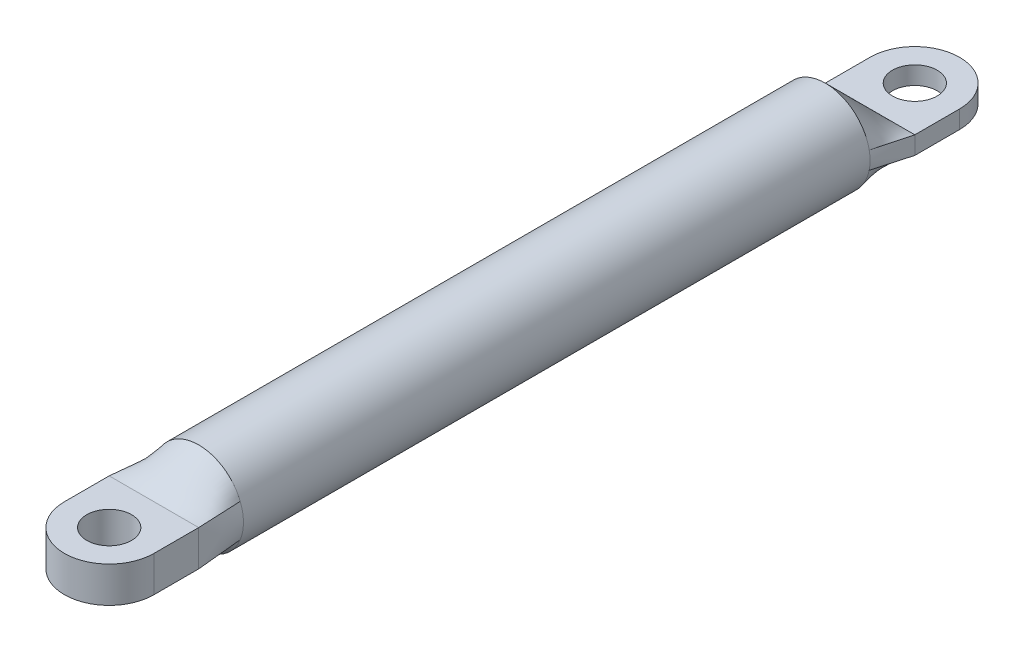
ISO-10303-21;
HEADER;
FILE_DESCRIPTION(('STEP AP214'),'2;1');
FILE_NAME('part.step','',(''),(''),'','','');
FILE_SCHEMA(('AUTOMOTIVE_DESIGN { 1 0 10303 214 1 1 1 1 }'));
ENDSEC;
DATA;
#1=APPLICATION_CONTEXT('core data for automotive mechanical design processes');
#2=APPLICATION_PROTOCOL_DEFINITION('international standard','automotive_design',2000,#1);
#3=PRODUCT_CONTEXT('',#1,'mechanical');
#4=PRODUCT('Part','Part','',(#3));
#5=PRODUCT_RELATED_PRODUCT_CATEGORY('part','',(#4));
#6=PRODUCT_DEFINITION_FORMATION('','',#4);
#7=PRODUCT_DEFINITION_CONTEXT('part definition',#1,'design');
#8=PRODUCT_DEFINITION('design','',#6,#7);
#9=PRODUCT_DEFINITION_SHAPE('','',#8);
#10=(LENGTH_UNIT() NAMED_UNIT(*) SI_UNIT(.MILLI.,.METRE.));
#11=(NAMED_UNIT(*) PLANE_ANGLE_UNIT() SI_UNIT($,.RADIAN.));
#12=(NAMED_UNIT(*) SI_UNIT($,.STERADIAN.) SOLID_ANGLE_UNIT());
#13=UNCERTAINTY_MEASURE_WITH_UNIT(LENGTH_MEASURE(1.E-05),#10,'distance_accuracy_value','');
#14=(GEOMETRIC_REPRESENTATION_CONTEXT(3) GLOBAL_UNCERTAINTY_ASSIGNED_CONTEXT((#13)) GLOBAL_UNIT_ASSIGNED_CONTEXT((#10,
#11,#12)) REPRESENTATION_CONTEXT('',''));
#15=CARTESIAN_POINT('',(0.,0.,0.));
#16=DIRECTION('',(0.,0.,1.));
#17=DIRECTION('',(1.,0.,0.));
#18=AXIS2_PLACEMENT_3D('',#15,#16,#17);
#19=CARTESIAN_POINT('',(-5.,2.,75.));
#20=DIRECTION('',(0.,1.,0.));
#21=DIRECTION('',(-1.,0.,0.));
#22=AXIS2_PLACEMENT_3D('',#19,#20,#21);
#23=PLANE('',#22);
#24=CARTESIAN_POINT('',(0.,2.,80.));
#25=DIRECTION('',(0.,1.,0.));
#26=DIRECTION('',(-1.,0.,0.));
#27=AXIS2_PLACEMENT_3D('',#24,#25,#26);
#28=CIRCLE('',#27,2.5);
#29=CARTESIAN_POINT('',(-2.5,2.,80.));
#30=VERTEX_POINT('',#29);
#31=EDGE_CURVE('E274',#30,#30,#28,.T.);
#32=ORIENTED_EDGE('',*,*,#31,.F.);
#33=EDGE_LOOP('',(#32));
#34=FACE_BOUND('',#33,.T.);
#35=CARTESIAN_POINT('',(0.,2.,80.));
#36=DIRECTION('',(0.,1.,0.));
#37=DIRECTION('',(-1.,0.,0.));
#38=AXIS2_PLACEMENT_3D('',#35,#36,#37);
#39=CIRCLE('',#38,5.);
#40=CARTESIAN_POINT('',(-5.,2.,80.));
#41=VERTEX_POINT('',#40);
#42=CARTESIAN_POINT('',(5.,2.,80.));
#43=VERTEX_POINT('',#42);
#44=EDGE_CURVE('E495',#41,#43,#39,.T.);
#45=ORIENTED_EDGE('',*,*,#44,.T.);
#46=DIRECTION('',(0.,0.,1.));
#47=VECTOR('',#46,1.);
#48=CARTESIAN_POINT('',(5.,2.,75.));
#49=LINE('',#48,#47);
#50=CARTESIAN_POINT('',(5.,2.,75.));
#51=VERTEX_POINT('',#50);
#52=EDGE_CURVE('E283',#51,#43,#49,.T.);
#53=ORIENTED_EDGE('',*,*,#52,.F.);
#54=DIRECTION('',(-1.,0.,0.));
#55=VECTOR('',#54,1.);
#56=CARTESIAN_POINT('',(-5.,2.,75.));
#57=LINE('',#56,#55);
#58=CARTESIAN_POINT('',(-5.,2.,75.));
#59=VERTEX_POINT('',#58);
#60=EDGE_CURVE('E345',#51,#59,#57,.T.);
#61=ORIENTED_EDGE('',*,*,#60,.T.);
#62=DIRECTION('',(0.,0.,1.));
#63=VECTOR('',#62,1.);
#64=CARTESIAN_POINT('',(-5.,2.,75.));
#65=LINE('',#64,#63);
#66=EDGE_CURVE('E290',#59,#41,#65,.T.);
#67=ORIENTED_EDGE('',*,*,#66,.T.);
#68=EDGE_LOOP('',(#45,#53,#61,#67));
#69=FACE_BOUND('',#68,.T.);
#70=ADVANCED_FACE('F174',(#34,#69),#23,.T.);
#71=CARTESIAN_POINT('',(-5.,-2.,75.));
#72=DIRECTION('',(0.,-1.,0.));
#73=DIRECTION('',(1.,0.,0.));
#74=AXIS2_PLACEMENT_3D('',#71,#72,#73);
#75=PLANE('',#74);
#76=CARTESIAN_POINT('',(0.,-2.,80.));
#77=DIRECTION('',(0.,-1.,0.));
#78=DIRECTION('',(1.,0.,0.));
#79=AXIS2_PLACEMENT_3D('',#76,#77,#78);
#80=CIRCLE('',#79,2.5);
#81=CARTESIAN_POINT('',(2.5,-2.,80.));
#82=VERTEX_POINT('',#81);
#83=EDGE_CURVE('E490',#82,#82,#80,.T.);
#84=ORIENTED_EDGE('',*,*,#83,.F.);
#85=EDGE_LOOP('',(#84));
#86=FACE_BOUND('',#85,.T.);
#87=DIRECTION('',(0.,0.,1.));
#88=VECTOR('',#87,1.);
#89=CARTESIAN_POINT('',(5.,-2.,75.));
#90=LINE('',#89,#88);
#91=CARTESIAN_POINT('',(5.,-2.,75.));
#92=VERTEX_POINT('',#91);
#93=CARTESIAN_POINT('',(5.,-2.,80.));
#94=VERTEX_POINT('',#93);
#95=EDGE_CURVE('E280',#92,#94,#90,.T.);
#96=ORIENTED_EDGE('',*,*,#95,.T.);
#97=CARTESIAN_POINT('',(0.,-2.,80.));
#98=DIRECTION('',(0.,-1.,0.));
#99=DIRECTION('',(1.,0.,0.));
#100=AXIS2_PLACEMENT_3D('',#97,#98,#99);
#101=CIRCLE('',#100,5.);
#102=CARTESIAN_POINT('',(-5.,-2.,80.));
#103=VERTEX_POINT('',#102);
#104=EDGE_CURVE('E265',#94,#103,#101,.T.);
#105=ORIENTED_EDGE('',*,*,#104,.T.);
#106=DIRECTION('',(0.,0.,1.));
#107=VECTOR('',#106,1.);
#108=CARTESIAN_POINT('',(-5.,-2.,75.));
#109=LINE('',#108,#107);
#110=CARTESIAN_POINT('',(-5.,-2.,75.));
#111=VERTEX_POINT('',#110);
#112=EDGE_CURVE('E288',#111,#103,#109,.T.);
#113=ORIENTED_EDGE('',*,*,#112,.F.);
#114=DIRECTION('',(1.,0.,0.));
#115=VECTOR('',#114,1.);
#116=CARTESIAN_POINT('',(-5.,-2.,75.));
#117=LINE('',#116,#115);
#118=EDGE_CURVE('E286',#111,#92,#117,.T.);
#119=ORIENTED_EDGE('',*,*,#118,.T.);
#120=EDGE_LOOP('',(#96,#105,#113,#119));
#121=FACE_BOUND('',#120,.T.);
#122=ADVANCED_FACE('F284',(#86,#121),#75,.T.);
#123=CARTESIAN_POINT('',(5.,2.,75.));
#124=DIRECTION('',(1.,0.,0.));
#125=DIRECTION('',(0.,0.,-1.));
#126=AXIS2_PLACEMENT_3D('',#123,#124,#125);
#127=PLANE('',#126);
#128=ORIENTED_EDGE('',*,*,#52,.T.);
#129=DIRECTION('',(0.,-1.,0.));
#130=VECTOR('',#129,1.);
#131=CARTESIAN_POINT('',(5.,8.,80.));
#132=LINE('',#131,#130);
#133=EDGE_CURVE('E12',#43,#94,#132,.T.);
#134=ORIENTED_EDGE('',*,*,#133,.T.);
#135=ORIENTED_EDGE('',*,*,#95,.F.);
#136=DIRECTION('',(0.,1.,0.));
#137=VECTOR('',#136,1.);
#138=CARTESIAN_POINT('',(5.,2.,75.));
#139=LINE('',#138,#137);
#140=EDGE_CURVE('E296',#92,#51,#139,.T.);
#141=ORIENTED_EDGE('',*,*,#140,.T.);
#142=EDGE_LOOP('',(#128,#134,#135,#141));
#143=FACE_BOUND('',#142,.T.);
#144=ADVANCED_FACE('F278',(#143),#127,.T.);
#145=CARTESIAN_POINT('',(-5.,-2.,-5.));
#146=DIRECTION('',(0.,-1.,0.));
#147=DIRECTION('',(1.,0.,0.));
#148=AXIS2_PLACEMENT_3D('',#145,#146,#147);
#149=PLANE('',#148);
#150=CARTESIAN_POINT('',(0.,-2.,-10.));
#151=DIRECTION('',(0.,-1.,0.));
#152=DIRECTION('',(1.,0.,0.));
#153=AXIS2_PLACEMENT_3D('',#150,#151,#152);
#154=CIRCLE('',#153,2.5);
#155=CARTESIAN_POINT('',(2.5,-2.,-10.));
#156=VERTEX_POINT('',#155);
#157=EDGE_CURVE('E505',#156,#156,#154,.T.);
#158=ORIENTED_EDGE('',*,*,#157,.F.);
#159=EDGE_LOOP('',(#158));
#160=FACE_BOUND('',#159,.T.);
#161=CARTESIAN_POINT('',(0.,-2.,-10.));
#162=DIRECTION('',(0.,-1.,0.));
#163=DIRECTION('',(1.,0.,0.));
#164=AXIS2_PLACEMENT_3D('',#161,#162,#163);
#165=CIRCLE('',#164,5.);
#166=CARTESIAN_POINT('',(-5.,-2.,-10.));
#167=VERTEX_POINT('',#166);
#168=CARTESIAN_POINT('',(5.,-2.,-10.));
#169=VERTEX_POINT('',#168);
#170=EDGE_CURVE('E497',#167,#169,#165,.T.);
#171=ORIENTED_EDGE('',*,*,#170,.T.);
#172=DIRECTION('',(0.,0.,-1.));
#173=VECTOR('',#172,1.);
#174=CARTESIAN_POINT('',(5.,-2.,-5.));
#175=LINE('',#174,#173);
#176=CARTESIAN_POINT('',(5.,-2.,-5.));
#177=VERTEX_POINT('',#176);
#178=EDGE_CURVE('E618',#177,#169,#175,.T.);
#179=ORIENTED_EDGE('',*,*,#178,.F.);
#180=DIRECTION('',(-1.,0.,0.));
#181=VECTOR('',#180,1.);
#182=CARTESIAN_POINT('',(-5.,-2.,-5.));
#183=LINE('',#182,#181);
#184=CARTESIAN_POINT('',(-5.,-2.,-5.));
#185=VERTEX_POINT('',#184);
#186=EDGE_CURVE('E582',#177,#185,#183,.T.);
#187=ORIENTED_EDGE('',*,*,#186,.T.);
#188=DIRECTION('',(0.,0.,-1.));
#189=VECTOR('',#188,1.);
#190=CARTESIAN_POINT('',(-5.,-2.,-5.));
#191=LINE('',#190,#189);
#192=EDGE_CURVE('E516',#185,#167,#191,.T.);
#193=ORIENTED_EDGE('',*,*,#192,.T.);
#194=EDGE_LOOP('',(#171,#179,#187,#193));
#195=FACE_BOUND('',#194,.T.);
#196=ADVANCED_FACE('F658',(#160,#195),#149,.T.);
#197=CARTESIAN_POINT('',(-5.,0.,-5.));
#198=DIRECTION('',(0.,1.,0.));
#199=DIRECTION('',(0.,0.,1.));
#200=AXIS2_PLACEMENT_3D('',#197,#198,#199);
#201=PLANE('',#200);
#202=CARTESIAN_POINT('',(0.,0.,-10.));
#203=DIRECTION('',(0.,1.,0.));
#204=DIRECTION('',(0.,0.,1.));
#205=AXIS2_PLACEMENT_3D('',#202,#203,#204);
#206=CIRCLE('',#205,2.5);
#207=CARTESIAN_POINT('',(0.,0.,-7.5));
#208=VERTEX_POINT('',#207);
#209=EDGE_CURVE('E292',#208,#208,#206,.T.);
#210=ORIENTED_EDGE('',*,*,#209,.F.);
#211=EDGE_LOOP('',(#210));
#212=FACE_BOUND('',#211,.T.);
#213=DIRECTION('',(0.,0.,-1.));
#214=VECTOR('',#213,1.);
#215=CARTESIAN_POINT('',(5.,0.,-5.));
#216=LINE('',#215,#214);
#217=CARTESIAN_POINT('',(5.,0.,-5.));
#218=VERTEX_POINT('',#217);
#219=CARTESIAN_POINT('',(5.,0.,-10.));
#220=VERTEX_POINT('',#219);
#221=EDGE_CURVE('E583',#218,#220,#216,.T.);
#222=ORIENTED_EDGE('',*,*,#221,.T.);
#223=CARTESIAN_POINT('',(0.,0.,-10.));
#224=DIRECTION('',(0.,1.,0.));
#225=DIRECTION('',(0.,0.,1.));
#226=AXIS2_PLACEMENT_3D('',#223,#224,#225);
#227=CIRCLE('',#226,5.);
#228=CARTESIAN_POINT('',(-5.,0.,-10.));
#229=VERTEX_POINT('',#228);
#230=EDGE_CURVE('E502',#220,#229,#227,.T.);
#231=ORIENTED_EDGE('',*,*,#230,.T.);
#232=DIRECTION('',(0.,0.,-1.));
#233=VECTOR('',#232,1.);
#234=CARTESIAN_POINT('',(-5.,0.,-5.));
#235=LINE('',#234,#233);
#236=CARTESIAN_POINT('',(-5.,0.,-5.));
#237=VERTEX_POINT('',#236);
#238=EDGE_CURVE('E625',#237,#229,#235,.T.);
#239=ORIENTED_EDGE('',*,*,#238,.F.);
#240=DIRECTION('',(1.,0.,0.));
#241=VECTOR('',#240,1.);
#242=CARTESIAN_POINT('',(-5.,0.,-5.));
#243=LINE('',#242,#241);
#244=EDGE_CURVE('E581',#237,#218,#243,.T.);
#245=ORIENTED_EDGE('',*,*,#244,.T.);
#246=EDGE_LOOP('',(#222,#231,#239,#245));
#247=FACE_BOUND('',#246,.T.);
#248=ADVANCED_FACE('F563',(#212,#247),#201,.T.);
#249=CARTESIAN_POINT('',(-5.,-2.,-5.));
#250=DIRECTION('',(-1.,0.,0.));
#251=DIRECTION('',(0.,-1.,0.));
#252=AXIS2_PLACEMENT_3D('',#249,#250,#251);
#253=PLANE('',#252);
#254=ORIENTED_EDGE('',*,*,#238,.T.);
#255=DIRECTION('',(0.,-1.,0.));
#256=VECTOR('',#255,1.);
#257=CARTESIAN_POINT('',(-5.,8.,-10.));
#258=LINE('',#257,#256);
#259=EDGE_CURVE('E499',#229,#167,#258,.T.);
#260=ORIENTED_EDGE('',*,*,#259,.T.);
#261=ORIENTED_EDGE('',*,*,#192,.F.);
#262=DIRECTION('',(0.,1.,0.));
#263=VECTOR('',#262,1.);
#264=CARTESIAN_POINT('',(-5.,-2.,-5.));
#265=LINE('',#264,#263);
#266=EDGE_CURVE('E644',#185,#237,#265,.T.);
#267=ORIENTED_EDGE('',*,*,#266,.T.);
#268=EDGE_LOOP('',(#254,#260,#261,#267));
#269=FACE_BOUND('',#268,.T.);
#270=ADVANCED_FACE('F649',(#269),#253,.T.);
#271=CARTESIAN_POINT('',(0.,0.,70.));
#272=DIRECTION('',(0.,0.,-1.));
#273=DIRECTION('',(-1.,0.,0.));
#274=AXIS2_PLACEMENT_3D('',#271,#272,#273);
#275=CYLINDRICAL_SURFACE('',#274,5.);
#276=CARTESIAN_POINT('',(4.6423834544263,1.85695338177052,70.));
#277=CARTESIAN_POINT('',(4.49870529350676,2.21614878406937,70.));
#278=CARTESIAN_POINT('',(4.30154981109881,2.58802255416943,70.));
#279=CARTESIAN_POINT('',(3.77223814216323,3.3123120198832,70.));
#280=CARTESIAN_POINT('',(3.43923374409662,3.66440961704776,70.));
#281=CARTESIAN_POINT('',(2.63502577278945,4.27935342835578,70.));
#282=CARTESIAN_POINT('',(2.16337330174003,4.54099630327165,70.));
#283=CARTESIAN_POINT('',(1.12751303544947,4.90199406608167,70.));
#284=CARTESIAN_POINT('',(0.564194134522417,5.,70.));
#285=CARTESIAN_POINT('',(-0.564194134522417,5.,70.));
#286=CARTESIAN_POINT('',(-1.12751303544947,4.90199406608167,70.));
#287=CARTESIAN_POINT('',(-2.16337330174003,4.54099630327165,70.));
#288=CARTESIAN_POINT('',(-2.63502577278945,4.27935342835578,70.));
#289=CARTESIAN_POINT('',(-3.43923374409662,3.66440961704776,70.));
#290=CARTESIAN_POINT('',(-3.77223814216323,3.3123120198832,70.));
#291=CARTESIAN_POINT('',(-4.30154981109881,2.58802255416943,70.));
#292=CARTESIAN_POINT('',(-4.49870529350676,2.21614878406937,70.));
#293=CARTESIAN_POINT('',(-4.6423834544263,1.85695338177052,70.));
#294=B_SPLINE_CURVE_WITH_KNOTS('',3,(#276,#277,#278,#279,#280,#281,#282,#283,#284,#285,#286,
#287,#288,#289,#290,#291,#292,#293),.UNSPECIFIED.,.F.,.F.,(4,2,2,2,2,2,2,2,4),(0.,0.125,0.25,
0.375,0.5,0.625,0.75,0.875,1.),.UNSPECIFIED.);
#295=CARTESIAN_POINT('',(4.64238538206064,1.85695415467658,70.));
#296=VERTEX_POINT('',#295);
#297=CARTESIAN_POINT('',(-4.6423935071418,1.85695742210553,70.));
#298=VERTEX_POINT('',#297);
#299=EDGE_CURVE('E431',#296,#298,#294,.T.);
#300=ORIENTED_EDGE('',*,*,#299,.F.);
#301=CARTESIAN_POINT('',(0.,0.,70.));
#302=DIRECTION('',(0.,0.,1.));
#303=DIRECTION('',(1.,0.,0.));
#304=AXIS2_PLACEMENT_3D('',#301,#302,#303);
#305=CIRCLE('',#304,5.);
#306=CARTESIAN_POINT('',(4.64239388700254,-1.85695757568858,70.));
#307=VERTEX_POINT('',#306);
#308=EDGE_CURVE('E442',#307,#296,#305,.T.);
#309=ORIENTED_EDGE('',*,*,#308,.F.);
#310=CARTESIAN_POINT('',(-4.64238576158105,-1.85695430712494,70.));
#311=VERTEX_POINT('',#310);
#312=EDGE_CURVE('E190',#311,#307,#305,.T.);
#313=ORIENTED_EDGE('',*,*,#312,.F.);
#314=EDGE_CURVE('E196',#298,#311,#305,.T.);
#315=ORIENTED_EDGE('',*,*,#314,.F.);
#316=EDGE_LOOP('',(#300,#309,#313,#315));
#317=FACE_BOUND('',#316,.T.);
#318=CARTESIAN_POINT('',(-4.9029033784546,0.980580675690921,0.));
#319=CARTESIAN_POINT('',(-4.82277517332639,1.38122170133195,0.));
#320=CARTESIAN_POINT('',(-4.68552918294742,1.81427330045434,0.));
#321=CARTESIAN_POINT('',(-4.23803019041123,2.69905009923053,0.));
#322=CARTESIAN_POINT('',(-3.92599697956843,3.15097619292763,0.));
#323=CARTESIAN_POINT('',(-3.09275421168397,3.97202399767275,0.));
#324=CARTESIAN_POINT('',(-2.56966190982729,4.33897322808948,0.));
#325=CARTESIAN_POINT('',(-1.6655051020658,4.7258391324945,0.));
#326=CARTESIAN_POINT('',(-1.34511491537968,4.82751837329654,0.));
#327=CARTESIAN_POINT('',(-0.68309613954826,4.9646397094076,0.));
#328=CARTESIAN_POINT('',(-0.341584959466065,5.,0.));
#329=CARTESIAN_POINT('',(0.341584959466066,5.,0.));
#330=CARTESIAN_POINT('',(0.68309613954826,4.9646397094076,0.));
#331=CARTESIAN_POINT('',(1.34511491537968,4.82751837329654,0.));
#332=CARTESIAN_POINT('',(1.6655051020658,4.7258391324945,0.));
#333=CARTESIAN_POINT('',(2.56966190982729,4.33897322808948,0.));
#334=CARTESIAN_POINT('',(3.09275421168397,3.97202399767275,0.));
#335=CARTESIAN_POINT('',(3.92599697956842,3.15097619292763,0.));
#336=CARTESIAN_POINT('',(4.23803019041124,2.69905009923053,0.));
#337=CARTESIAN_POINT('',(4.68552918294742,1.81427330045434,0.));
#338=CARTESIAN_POINT('',(4.82277517332639,1.38122170133195,0.));
#339=CARTESIAN_POINT('',(4.9029033784546,0.980580675690918,0.));
#340=B_SPLINE_CURVE_WITH_KNOTS('',3,(#318,#319,#320,#321,#322,#323,#324,#325,#326,#327,#328,
#329,#330,#331,#332,#333,#334,#335,#336,#337,#338,#339),.UNSPECIFIED.,.F.,.F.,(4,2,2,2,2,2,2,2,
2,2,4),(0.,0.125,0.25,0.375,0.4375,0.5,0.5625,0.625,0.75,0.875,1.),.UNSPECIFIED.);
#341=CARTESIAN_POINT('',(4.90342057429518,0.980684180448184,0.));
#342=VERTEX_POINT('',#341);
#343=CARTESIAN_POINT('',(-4.9033645088601,0.980672996415892,0.));
#344=VERTEX_POINT('',#343);
#345=EDGE_CURVE('E595',#342,#344,#340,.F.);
#346=ORIENTED_EDGE('',*,*,#345,.T.);
#347=CARTESIAN_POINT('',(0.,0.,0.));
#348=DIRECTION('',(0.,0.,1.));
#349=DIRECTION('',(1.,0.,0.));
#350=AXIS2_PLACEMENT_3D('',#347,#348,#349);
#351=CIRCLE('',#350,5.);
#352=CARTESIAN_POINT('',(-4.90336493756195,-0.980672932522098,0.));
#353=VERTEX_POINT('',#352);
#354=EDGE_CURVE('E614',#344,#353,#351,.T.);
#355=ORIENTED_EDGE('',*,*,#354,.T.);
#356=CARTESIAN_POINT('',(4.90330892844045,-0.98066176918323,0.));
#357=VERTEX_POINT('',#356);
#358=EDGE_CURVE('E610',#353,#357,#351,.T.);
#359=ORIENTED_EDGE('',*,*,#358,.T.);
#360=EDGE_CURVE('E612',#357,#342,#351,.T.);
#361=ORIENTED_EDGE('',*,*,#360,.T.);
#362=EDGE_LOOP('',(#346,#355,#359,#361));
#363=FACE_BOUND('',#362,.T.);
#364=ADVANCED_FACE('F176',(#317,#363),#275,.T.);
#365=CARTESIAN_POINT('',(4.9029033784546,-0.980580675690924,0.));
#366=CARTESIAN_POINT('',(5.,-2.,-5.));
#367=CARTESIAN_POINT('',(4.82277517332639,-1.38122170133195,0.));
#368=CARTESIAN_POINT('',(4.58333333333333,-2.,-5.));
#369=CARTESIAN_POINT('',(4.68552918294742,-1.81427330045434,0.));
#370=CARTESIAN_POINT('',(4.16666666666667,-2.,-5.));
#371=CARTESIAN_POINT('',(4.23803019041123,-2.69905009923053,0.));
#372=CARTESIAN_POINT('',(3.33333333333333,-2.,-5.));
#373=CARTESIAN_POINT('',(3.92599697956842,-3.15097619292764,0.));
#374=CARTESIAN_POINT('',(2.91666666666667,-2.,-5.));
#375=CARTESIAN_POINT('',(3.09275421168397,-3.97202399767275,0.));
#376=CARTESIAN_POINT('',(2.08333333333333,-2.,-5.));
#377=CARTESIAN_POINT('',(2.56966190982729,-4.33897322808948,0.));
#378=CARTESIAN_POINT('',(1.66666666666667,-2.,-5.));
#379=CARTESIAN_POINT('',(1.6655051020658,-4.7258391324945,0.));
#380=CARTESIAN_POINT('',(1.04166666666667,-2.,-5.));
#381=CARTESIAN_POINT('',(1.34511491537967,-4.82751837329654,0.));
#382=CARTESIAN_POINT('',(0.833333333333332,-2.,-5.));
#383=CARTESIAN_POINT('',(0.683096139548257,-4.9646397094076,0.));
#384=CARTESIAN_POINT('',(0.416666666666665,-2.,-5.));
#385=CARTESIAN_POINT('',(0.341584959466062,-5.,0.));
#386=CARTESIAN_POINT('',(0.208333333333331,-2.,-5.));
#387=CARTESIAN_POINT('',(-0.341584959466068,-5.,0.));
#388=CARTESIAN_POINT('',(-0.208333333333336,-2.,-5.));
#389=CARTESIAN_POINT('',(-0.683096139548263,-4.9646397094076,0.));
#390=CARTESIAN_POINT('',(-0.416666666666668,-2.,-5.));
#391=CARTESIAN_POINT('',(-1.34511491537968,-4.82751837329654,0.));
#392=CARTESIAN_POINT('',(-0.833333333333334,-2.,-5.));
#393=CARTESIAN_POINT('',(-1.66550510206581,-4.7258391324945,0.));
#394=CARTESIAN_POINT('',(-1.04166666666667,-2.,-5.));
#395=CARTESIAN_POINT('',(-2.56966190982729,-4.33897322808948,0.));
#396=CARTESIAN_POINT('',(-1.66666666666667,-2.,-5.));
#397=CARTESIAN_POINT('',(-3.09275421168397,-3.97202399767275,0.));
#398=CARTESIAN_POINT('',(-2.08333333333333,-2.,-5.));
#399=CARTESIAN_POINT('',(-3.92599697956843,-3.15097619292763,0.));
#400=CARTESIAN_POINT('',(-2.91666666666667,-2.,-5.));
#401=CARTESIAN_POINT('',(-4.23803019041124,-2.69905009923052,0.));
#402=CARTESIAN_POINT('',(-3.33333333333333,-2.,-5.));
#403=CARTESIAN_POINT('',(-4.68552918294742,-1.81427330045433,0.));
#404=CARTESIAN_POINT('',(-4.16666666666667,-2.,-5.));
#405=CARTESIAN_POINT('',(-4.8227751733264,-1.38122170133194,0.));
#406=CARTESIAN_POINT('',(-4.58333333333333,-2.,-5.));
#407=CARTESIAN_POINT('',(-4.9029033784546,-0.980580675690917,0.));
#408=CARTESIAN_POINT('',(-5.,-2.,-5.));
#409=B_SPLINE_SURFACE_WITH_KNOTS('',3,1,((#365,#366),(#367,#368),(#369,#370),(#371,#372),(#373,
#374),(#375,#376),(#377,#378),(#379,#380),(#381,#382),(#383,#384),(#385,#386),(#387,#388),(#389,
#390),(#391,#392),(#393,#394),(#395,#396),(#397,#398),(#399,#400),(#401,#402),(#403,#404),(#405,
#406),(#407,#408)),.UNSPECIFIED.,.F.,.F.,.F.,(4,2,2,2,2,2,2,2,2,2,4),(2,2),(0.,0.125,0.25,0.375,
0.4375,0.5,0.5625,0.625,0.75,0.875,1.),(0.,1.),.UNSPECIFIED.);
#410=DIRECTION('',(-0.0190244260279846,-0.199737820102712,-0.979664674485572));
#411=VECTOR('',#410,1.);
#412=CARTESIAN_POINT('',(-4.9514516892273,-1.49029033784546,-2.5));
#413=LINE('',#412,#411);
#414=EDGE_CURVE('E615',#353,#185,#413,.T.);
#415=DIRECTION('',(-0.0190244260279844,0.199737820102711,0.979664674485572));
#416=VECTOR('',#415,1.);
#417=CARTESIAN_POINT('',(4.9514516892273,-1.49029033784546,-2.5));
#418=LINE('',#417,#416);
#419=EDGE_CURVE('E754',#177,#357,#418,.T.);
#420=ORIENTED_EDGE('',*,*,#358,.F.);
#421=ORIENTED_EDGE('',*,*,#414,.T.);
#422=ORIENTED_EDGE('',*,*,#186,.F.);
#423=ORIENTED_EDGE('',*,*,#419,.T.);
#424=EDGE_LOOP('',(#420,#421,#422,#423));
#425=FACE_BOUND('',#424,.T.);
#426=ADVANCED_FACE('F663',(#425),#409,.T.);
#427=CARTESIAN_POINT('',(-4.9029033784546,-0.980580675690918,0.));
#428=CARTESIAN_POINT('',(-5.,-2.,-5.));
#429=CARTESIAN_POINT('',(-4.96700594255717,-0.660067855178098,0.));
#430=CARTESIAN_POINT('',(-5.,-1.66666666666667,-5.));
#431=CARTESIAN_POINT('',(-4.99905722460845,-0.330033927589048,0.));
#432=CARTESIAN_POINT('',(-5.,-1.33333333333333,-5.));
#433=CARTESIAN_POINT('',(-4.99905722460845,0.330033927589051,0.));
#434=CARTESIAN_POINT('',(-5.,-0.666666666666665,-5.));
#435=CARTESIAN_POINT('',(-4.96700594255716,0.660067855178101,0.));
#436=CARTESIAN_POINT('',(-5.,-0.333333333333332,-5.));
#437=CARTESIAN_POINT('',(-4.9029033784546,0.980580675690921,0.));
#438=CARTESIAN_POINT('',(-5.,0.,-5.));
#439=B_SPLINE_SURFACE_WITH_KNOTS('',3,1,((#427,#428),(#429,#430),(#431,#432),(#433,#434),(#435,
#436),(#437,#438)),.UNSPECIFIED.,.F.,.F.,.F.,(4,2,4),(2,2),(0.,0.5,1.),(0.,1.),.UNSPECIFIED.);
#440=DIRECTION('',(-0.0190528551333828,-0.192415155781688,-0.981128634041824));
#441=VECTOR('',#440,1.);
#442=CARTESIAN_POINT('',(-4.9514516892273,0.490290337845461,-2.5));
#443=LINE('',#442,#441);
#444=EDGE_CURVE('E747',#344,#237,#443,.T.);
#445=ORIENTED_EDGE('',*,*,#354,.F.);
#446=ORIENTED_EDGE('',*,*,#444,.T.);
#447=ORIENTED_EDGE('',*,*,#266,.F.);
#448=ORIENTED_EDGE('',*,*,#414,.F.);
#449=EDGE_LOOP('',(#445,#446,#447,#448));
#450=FACE_BOUND('',#449,.T.);
#451=ADVANCED_FACE('F687',(#450),#439,.T.);
#452=CARTESIAN_POINT('',(4.9029033784546,0.980580675690919,0.));
#453=CARTESIAN_POINT('',(5.,0.,-5.));
#454=CARTESIAN_POINT('',(4.96700594255716,0.660067855178098,0.));
#455=CARTESIAN_POINT('',(5.,-0.333333333333334,-5.));
#456=CARTESIAN_POINT('',(4.99905722460845,0.330033927589048,0.));
#457=CARTESIAN_POINT('',(5.,-0.666666666666667,-5.));
#458=CARTESIAN_POINT('',(4.99905722460845,-0.330033927589053,0.));
#459=CARTESIAN_POINT('',(5.,-1.33333333333333,-5.));
#460=CARTESIAN_POINT('',(4.96700594255716,-0.660067855178104,0.));
#461=CARTESIAN_POINT('',(5.,-1.66666666666667,-5.));
#462=CARTESIAN_POINT('',(4.9029033784546,-0.980580675690924,0.));
#463=CARTESIAN_POINT('',(5.,-2.,-5.));
#464=B_SPLINE_SURFACE_WITH_KNOTS('',3,1,((#452,#453),(#454,#455),(#456,#457),(#458,#459),(#460,
#461),(#462,#463)),.UNSPECIFIED.,.F.,.F.,.F.,(4,2,4),(2,2),(0.,0.5,1.),(0.,1.),.UNSPECIFIED.);
#465=DIRECTION('',(0.,-1.,0.));
#466=VECTOR('',#465,1.);
#467=CARTESIAN_POINT('',(5.,-2.,-5.));
#468=LINE('',#467,#466);
#469=EDGE_CURVE('E573',#218,#177,#468,.T.);
#470=DIRECTION('',(0.0190528551333828,-0.192415155781688,-0.981128634041824));
#471=VECTOR('',#470,1.);
#472=CARTESIAN_POINT('',(4.9514516892273,0.490290337845459,-2.5));
#473=LINE('',#472,#471);
#474=EDGE_CURVE('E755',#342,#218,#473,.T.);
#475=ORIENTED_EDGE('',*,*,#360,.F.);
#476=ORIENTED_EDGE('',*,*,#419,.F.);
#477=ORIENTED_EDGE('',*,*,#469,.F.);
#478=ORIENTED_EDGE('',*,*,#474,.F.);
#479=EDGE_LOOP('',(#475,#476,#477,#478));
#480=FACE_BOUND('',#479,.T.);
#481=ADVANCED_FACE('F558',(#480),#464,.T.);
#482=CARTESIAN_POINT('',(-4.9029033784546,0.980580675690921,0.));
#483=CARTESIAN_POINT('',(-5.,0.,-5.));
#484=CARTESIAN_POINT('',(-4.82277517332639,1.38122170133195,0.));
#485=CARTESIAN_POINT('',(-4.58333333333333,0.,-5.));
#486=CARTESIAN_POINT('',(-4.68552918294742,1.81427330045434,0.));
#487=CARTESIAN_POINT('',(-4.16666666666667,0.,-5.));
#488=CARTESIAN_POINT('',(-4.23803019041123,2.69905009923053,0.));
#489=CARTESIAN_POINT('',(-3.33333333333333,0.,-5.));
#490=CARTESIAN_POINT('',(-3.92599697956843,3.15097619292763,0.));
#491=CARTESIAN_POINT('',(-2.91666666666667,0.,-5.));
#492=CARTESIAN_POINT('',(-3.09275421168397,3.97202399767275,0.));
#493=CARTESIAN_POINT('',(-2.08333333333333,0.,-5.));
#494=CARTESIAN_POINT('',(-2.56966190982729,4.33897322808948,0.));
#495=CARTESIAN_POINT('',(-1.66666666666666,0.,-5.));
#496=CARTESIAN_POINT('',(-1.6655051020658,4.7258391324945,0.));
#497=CARTESIAN_POINT('',(-1.04166666666666,0.,-5.));
#498=CARTESIAN_POINT('',(-1.34511491537968,4.82751837329654,0.));
#499=CARTESIAN_POINT('',(-0.833333333333332,0.,-5.));
#500=CARTESIAN_POINT('',(-0.68309613954826,4.9646397094076,0.));
#501=CARTESIAN_POINT('',(-0.416666666666665,0.,-5.));
#502=CARTESIAN_POINT('',(-0.341584959466065,5.,0.));
#503=CARTESIAN_POINT('',(-0.208333333333332,0.,-5.));
#504=CARTESIAN_POINT('',(0.341584959466066,5.,0.));
#505=CARTESIAN_POINT('',(0.208333333333334,0.,-5.));
#506=CARTESIAN_POINT('',(0.68309613954826,4.9646397094076,0.));
#507=CARTESIAN_POINT('',(0.416666666666668,0.,-5.));
#508=CARTESIAN_POINT('',(1.34511491537968,4.82751837329654,0.));
#509=CARTESIAN_POINT('',(0.833333333333335,0.,-5.));
#510=CARTESIAN_POINT('',(1.6655051020658,4.7258391324945,0.));
#511=CARTESIAN_POINT('',(1.04166666666667,0.,-5.));
#512=CARTESIAN_POINT('',(2.56966190982729,4.33897322808948,0.));
#513=CARTESIAN_POINT('',(1.66666666666667,0.,-5.));
#514=CARTESIAN_POINT('',(3.09275421168397,3.97202399767275,0.));
#515=CARTESIAN_POINT('',(2.08333333333333,0.,-5.));
#516=CARTESIAN_POINT('',(3.92599697956842,3.15097619292763,0.));
#517=CARTESIAN_POINT('',(2.91666666666667,0.,-5.));
#518=CARTESIAN_POINT('',(4.23803019041124,2.69905009923053,0.));
#519=CARTESIAN_POINT('',(3.33333333333333,0.,-5.));
#520=CARTESIAN_POINT('',(4.68552918294742,1.81427330045434,0.));
#521=CARTESIAN_POINT('',(4.16666666666667,0.,-5.));
#522=CARTESIAN_POINT('',(4.82277517332639,1.38122170133195,0.));
#523=CARTESIAN_POINT('',(4.58333333333333,0.,-5.));
#524=CARTESIAN_POINT('',(4.9029033784546,0.980580675690918,0.));
#525=CARTESIAN_POINT('',(5.,0.,-5.));
#526=B_SPLINE_SURFACE_WITH_KNOTS('',3,1,((#482,#483),(#484,#485),(#486,#487),(#488,#489),(#490,
#491),(#492,#493),(#494,#495),(#496,#497),(#498,#499),(#500,#501),(#502,#503),(#504,#505),(#506,
#507),(#508,#509),(#510,#511),(#512,#513),(#514,#515),(#516,#517),(#518,#519),(#520,#521),(#522,
#523),(#524,#525)),.UNSPECIFIED.,.F.,.F.,.F.,(4,2,2,2,2,2,2,2,2,2,4),(2,2),(0.,0.125,0.25,0.375,
0.4375,0.5,0.5625,0.625,0.75,0.875,1.),(0.,1.),.UNSPECIFIED.);
#527=ORIENTED_EDGE('',*,*,#345,.F.);
#528=ORIENTED_EDGE('',*,*,#474,.T.);
#529=ORIENTED_EDGE('',*,*,#244,.F.);
#530=ORIENTED_EDGE('',*,*,#444,.F.);
#531=EDGE_LOOP('',(#527,#528,#529,#530));
#532=FACE_BOUND('',#531,.T.);
#533=ADVANCED_FACE('F553',(#532),#526,.T.);
#534=CARTESIAN_POINT('',(5.,-2.,-5.));
#535=DIRECTION('',(1.,0.,0.));
#536=DIRECTION('',(0.,1.,0.));
#537=AXIS2_PLACEMENT_3D('',#534,#535,#536);
#538=PLANE('',#537);
#539=DIRECTION('',(0.,-1.,0.));
#540=VECTOR('',#539,1.);
#541=CARTESIAN_POINT('',(5.,8.,-10.));
#542=LINE('',#541,#540);
#543=EDGE_CURVE('E183',#220,#169,#542,.T.);
#544=ORIENTED_EDGE('',*,*,#543,.F.);
#545=ORIENTED_EDGE('',*,*,#221,.F.);
#546=ORIENTED_EDGE('',*,*,#469,.T.);
#547=ORIENTED_EDGE('',*,*,#178,.T.);
#548=EDGE_LOOP('',(#544,#545,#546,#547));
#549=FACE_BOUND('',#548,.T.);
#550=ADVANCED_FACE('F548',(#549),#538,.T.);
#551=CARTESIAN_POINT('',(-4.6423834544263,1.85695338177052,70.));
#552=CARTESIAN_POINT('',(-5.,2.,75.));
#553=CARTESIAN_POINT('',(-4.87226851189756,1.28224073809236,70.));
#554=CARTESIAN_POINT('',(-5.,1.33333333333333,75.));
#555=CARTESIAN_POINT('',(-5.,0.641941345224174,70.));
#556=CARTESIAN_POINT('',(-5.,0.666666666666664,75.));
#557=CARTESIAN_POINT('',(-5.,-0.641941345224173,70.));
#558=CARTESIAN_POINT('',(-5.,-0.666666666666669,75.));
#559=CARTESIAN_POINT('',(-4.87226851189756,-1.28224073809236,70.));
#560=CARTESIAN_POINT('',(-5.,-1.33333333333334,75.));
#561=CARTESIAN_POINT('',(-4.6423834544263,-1.85695338177052,70.));
#562=CARTESIAN_POINT('',(-5.,-2.,75.));
#563=B_SPLINE_SURFACE_WITH_KNOTS('',3,1,((#551,#552),(#553,#554),(#555,#556),(#557,#558),(#559,
#560),(#561,#562)),.UNSPECIFIED.,.F.,.F.,.F.,(4,2,4),(2,2),(0.,0.5,1.),(0.,1.),.UNSPECIFIED.);
#564=DIRECTION('',(-0.0713120365150496,-0.0285248146060203,0.997046101441537));
#565=VECTOR('',#564,1.);
#566=CARTESIAN_POINT('',(-4.82119172721315,-1.92847669088526,72.5));
#567=LINE('',#566,#565);
#568=EDGE_CURVE('E459',#311,#111,#567,.T.);
#569=DIRECTION('',(0.,-1.,0.));
#570=VECTOR('',#569,1.);
#571=CARTESIAN_POINT('',(-5.,2.,75.));
#572=LINE('',#571,#570);
#573=EDGE_CURVE('E337',#59,#111,#572,.T.);
#574=DIRECTION('',(0.0713120365150499,-0.0285248146060197,-0.997046101441537));
#575=VECTOR('',#574,1.);
#576=CARTESIAN_POINT('',(-4.82119172721315,1.92847669088526,72.5));
#577=LINE('',#576,#575);
#578=EDGE_CURVE('E381',#59,#298,#577,.T.);
#579=ORIENTED_EDGE('',*,*,#314,.T.);
#580=ORIENTED_EDGE('',*,*,#568,.T.);
#581=ORIENTED_EDGE('',*,*,#573,.F.);
#582=ORIENTED_EDGE('',*,*,#578,.T.);
#583=EDGE_LOOP('',(#579,#580,#581,#582));
#584=FACE_BOUND('',#583,.T.);
#585=ADVANCED_FACE('F325',(#584),#563,.T.);
#586=CARTESIAN_POINT('',(-4.6423834544263,-1.85695338177052,70.));
#587=CARTESIAN_POINT('',(-5.,-2.,75.));
#588=CARTESIAN_POINT('',(-4.49870529350676,-2.21614878406937,70.));
#589=CARTESIAN_POINT('',(-4.58333333333333,-2.,75.));
#590=CARTESIAN_POINT('',(-4.30154981109881,-2.58802255416943,70.));
#591=CARTESIAN_POINT('',(-4.16666666666667,-2.,75.));
#592=CARTESIAN_POINT('',(-3.77223814216323,-3.3123120198832,70.));
#593=CARTESIAN_POINT('',(-3.33333333333333,-2.,75.));
#594=CARTESIAN_POINT('',(-3.43923374409662,-3.66440961704776,70.));
#595=CARTESIAN_POINT('',(-2.91666666666667,-2.,75.));
#596=CARTESIAN_POINT('',(-2.63502577278945,-4.27935342835578,70.));
#597=CARTESIAN_POINT('',(-2.08333333333333,-2.,75.));
#598=CARTESIAN_POINT('',(-2.16337330174003,-4.54099630327165,70.));
#599=CARTESIAN_POINT('',(-1.66666666666667,-2.,75.));
#600=CARTESIAN_POINT('',(-1.12751303544947,-4.90199406608167,70.));
#601=CARTESIAN_POINT('',(-0.833333333333335,-2.,75.));
#602=CARTESIAN_POINT('',(-0.564194134522418,-5.,70.));
#603=CARTESIAN_POINT('',(-0.416666666666668,-2.,75.));
#604=CARTESIAN_POINT('',(0.564194134522417,-5.,70.));
#605=CARTESIAN_POINT('',(0.416666666666665,-2.,75.));
#606=CARTESIAN_POINT('',(1.12751303544947,-4.90199406608167,70.));
#607=CARTESIAN_POINT('',(0.833333333333332,-2.,75.));
#608=CARTESIAN_POINT('',(2.16337330174003,-4.54099630327165,70.));
#609=CARTESIAN_POINT('',(1.66666666666666,-2.,75.));
#610=CARTESIAN_POINT('',(2.63502577278945,-4.27935342835578,70.));
#611=CARTESIAN_POINT('',(2.08333333333333,-2.,75.));
#612=CARTESIAN_POINT('',(3.43923374409662,-3.66440961704776,70.));
#613=CARTESIAN_POINT('',(2.91666666666666,-2.,75.));
#614=CARTESIAN_POINT('',(3.77223814216323,-3.3123120198832,70.));
#615=CARTESIAN_POINT('',(3.33333333333333,-2.,75.));
#616=CARTESIAN_POINT('',(4.30154981109881,-2.58802255416943,70.));
#617=CARTESIAN_POINT('',(4.16666666666667,-2.,75.));
#618=CARTESIAN_POINT('',(4.49870529350676,-2.21614878406937,70.));
#619=CARTESIAN_POINT('',(4.58333333333333,-2.,75.));
#620=CARTESIAN_POINT('',(4.6423834544263,-1.85695338177052,70.));
#621=CARTESIAN_POINT('',(5.,-2.,75.));
#622=B_SPLINE_SURFACE_WITH_KNOTS('',3,1,((#586,#587),(#588,#589),(#590,#591),(#592,#593),(#594,
#595),(#596,#597),(#598,#599),(#600,#601),(#602,#603),(#604,#605),(#606,#607),(#608,#609),(#610,
#611),(#612,#613),(#614,#615),(#616,#617),(#618,#619),(#620,#621)),.UNSPECIFIED.,.F.,.F.,.F.,(4,
2,2,2,2,2,2,2,4),(2,2),(0.,0.125,0.25,0.375,0.5,0.625,0.75,0.875,1.),(0.,1.),.UNSPECIFIED.);
#623=DIRECTION('',(0.0713120365150501,-0.02852481460602,0.997046101441537));
#624=VECTOR('',#623,1.);
#625=CARTESIAN_POINT('',(4.82119172721315,-1.92847669088526,72.5));
#626=LINE('',#625,#624);
#627=EDGE_CURVE('E377',#307,#92,#626,.T.);
#628=ORIENTED_EDGE('',*,*,#312,.T.);
#629=ORIENTED_EDGE('',*,*,#627,.T.);
#630=ORIENTED_EDGE('',*,*,#118,.F.);
#631=ORIENTED_EDGE('',*,*,#568,.F.);
#632=EDGE_LOOP('',(#628,#629,#630,#631));
#633=FACE_BOUND('',#632,.T.);
#634=ADVANCED_FACE('F408',(#633),#622,.T.);
#635=CARTESIAN_POINT('',(4.6423834544263,1.85695338177052,70.));
#636=CARTESIAN_POINT('',(5.,2.,75.));
#637=CARTESIAN_POINT('',(4.49870529350676,2.21614878406937,70.));
#638=CARTESIAN_POINT('',(4.58333333333333,2.,75.));
#639=CARTESIAN_POINT('',(4.30154981109881,2.58802255416943,70.));
#640=CARTESIAN_POINT('',(4.16666666666667,2.,75.));
#641=CARTESIAN_POINT('',(3.77223814216323,3.3123120198832,70.));
#642=CARTESIAN_POINT('',(3.33333333333333,2.,75.));
#643=CARTESIAN_POINT('',(3.43923374409662,3.66440961704776,70.));
#644=CARTESIAN_POINT('',(2.91666666666667,2.,75.));
#645=CARTESIAN_POINT('',(2.63502577278945,4.27935342835578,70.));
#646=CARTESIAN_POINT('',(2.08333333333334,2.,75.));
#647=CARTESIAN_POINT('',(2.16337330174003,4.54099630327165,70.));
#648=CARTESIAN_POINT('',(1.66666666666667,2.,75.));
#649=CARTESIAN_POINT('',(1.12751303544947,4.90199406608167,70.));
#650=CARTESIAN_POINT('',(0.833333333333336,2.,75.));
#651=CARTESIAN_POINT('',(0.564194134522417,5.,70.));
#652=CARTESIAN_POINT('',(0.41666666666667,2.,75.));
#653=CARTESIAN_POINT('',(-0.564194134522417,5.,70.));
#654=CARTESIAN_POINT('',(-0.416666666666664,2.,75.));
#655=CARTESIAN_POINT('',(-1.12751303544947,4.90199406608167,70.));
#656=CARTESIAN_POINT('',(-0.83333333333333,2.,75.));
#657=CARTESIAN_POINT('',(-2.16337330174003,4.54099630327165,70.));
#658=CARTESIAN_POINT('',(-1.66666666666666,2.,75.));
#659=CARTESIAN_POINT('',(-2.63502577278945,4.27935342835578,70.));
#660=CARTESIAN_POINT('',(-2.08333333333333,2.,75.));
#661=CARTESIAN_POINT('',(-3.43923374409662,3.66440961704776,70.));
#662=CARTESIAN_POINT('',(-2.91666666666666,2.,75.));
#663=CARTESIAN_POINT('',(-3.77223814216323,3.3123120198832,70.));
#664=CARTESIAN_POINT('',(-3.33333333333333,2.,75.));
#665=CARTESIAN_POINT('',(-4.30154981109881,2.58802255416943,70.));
#666=CARTESIAN_POINT('',(-4.16666666666667,2.,75.));
#667=CARTESIAN_POINT('',(-4.49870529350676,2.21614878406937,70.));
#668=CARTESIAN_POINT('',(-4.58333333333333,2.,75.));
#669=CARTESIAN_POINT('',(-4.6423834544263,1.85695338177052,70.));
#670=CARTESIAN_POINT('',(-5.,2.,75.));
#671=B_SPLINE_SURFACE_WITH_KNOTS('',3,1,((#635,#636),(#637,#638),(#639,#640),(#641,#642),(#643,
#644),(#645,#646),(#647,#648),(#649,#650),(#651,#652),(#653,#654),(#655,#656),(#657,#658),(#659,
#660),(#661,#662),(#663,#664),(#665,#666),(#667,#668),(#669,#670)),.UNSPECIFIED.,.F.,.F.,.F.,(4,
2,2,2,2,2,2,2,4),(2,2),(0.,0.125,0.25,0.375,0.5,0.625,0.75,0.875,1.),(0.,1.),.UNSPECIFIED.);
#672=DIRECTION('',(0.0713120365150499,0.02852481460602,0.997046101441537));
#673=VECTOR('',#672,1.);
#674=CARTESIAN_POINT('',(4.82119172721315,1.92847669088526,72.5));
#675=LINE('',#674,#673);
#676=EDGE_CURVE('E376',#296,#51,#675,.T.);
#677=ORIENTED_EDGE('',*,*,#299,.T.);
#678=ORIENTED_EDGE('',*,*,#578,.F.);
#679=ORIENTED_EDGE('',*,*,#60,.F.);
#680=ORIENTED_EDGE('',*,*,#676,.F.);
#681=EDGE_LOOP('',(#677,#678,#679,#680));
#682=FACE_BOUND('',#681,.T.);
#683=ADVANCED_FACE('F398',(#682),#671,.T.);
#684=CARTESIAN_POINT('',(4.6423834544263,-1.85695338177052,70.));
#685=CARTESIAN_POINT('',(5.,-2.,75.));
#686=CARTESIAN_POINT('',(4.87226851189756,-1.28224073809236,70.));
#687=CARTESIAN_POINT('',(5.,-1.33333333333333,75.));
#688=CARTESIAN_POINT('',(5.,-0.641941345224174,70.));
#689=CARTESIAN_POINT('',(5.,-0.666666666666665,75.));
#690=CARTESIAN_POINT('',(5.,0.641941345224173,70.));
#691=CARTESIAN_POINT('',(5.,0.666666666666668,75.));
#692=CARTESIAN_POINT('',(4.87226851189756,1.28224073809236,70.));
#693=CARTESIAN_POINT('',(5.,1.33333333333333,75.));
#694=CARTESIAN_POINT('',(4.6423834544263,1.85695338177052,70.));
#695=CARTESIAN_POINT('',(5.,2.,75.));
#696=B_SPLINE_SURFACE_WITH_KNOTS('',3,1,((#684,#685),(#686,#687),(#688,#689),(#690,#691),(#692,
#693),(#694,#695)),.UNSPECIFIED.,.F.,.F.,.F.,(4,2,4),(2,2),(0.,0.5,1.),(0.,1.),.UNSPECIFIED.);
#697=ORIENTED_EDGE('',*,*,#308,.T.);
#698=ORIENTED_EDGE('',*,*,#676,.T.);
#699=ORIENTED_EDGE('',*,*,#140,.F.);
#700=ORIENTED_EDGE('',*,*,#627,.F.);
#701=EDGE_LOOP('',(#697,#698,#699,#700));
#702=FACE_BOUND('',#701,.T.);
#703=ADVANCED_FACE('F323',(#702),#696,.T.);
#704=CARTESIAN_POINT('',(-5.,2.,75.));
#705=DIRECTION('',(-1.,0.,0.));
#706=DIRECTION('',(0.,-1.,0.));
#707=AXIS2_PLACEMENT_3D('',#704,#705,#706);
#708=PLANE('',#707);
#709=DIRECTION('',(0.,-1.,0.));
#710=VECTOR('',#709,1.);
#711=CARTESIAN_POINT('',(-5.,8.,80.));
#712=LINE('',#711,#710);
#713=EDGE_CURVE('E269',#41,#103,#712,.T.);
#714=ORIENTED_EDGE('',*,*,#713,.F.);
#715=ORIENTED_EDGE('',*,*,#66,.F.);
#716=ORIENTED_EDGE('',*,*,#573,.T.);
#717=ORIENTED_EDGE('',*,*,#112,.T.);
#718=EDGE_LOOP('',(#714,#715,#716,#717));
#719=FACE_BOUND('',#718,.T.);
#720=ADVANCED_FACE('F318',(#719),#708,.T.);
#721=CARTESIAN_POINT('',(0.,8.,-10.));
#722=DIRECTION('',(0.,-1.,0.));
#723=DIRECTION('',(1.,0.,0.));
#724=AXIS2_PLACEMENT_3D('',#721,#722,#723);
#725=CYLINDRICAL_SURFACE('',#724,2.5);
#726=ORIENTED_EDGE('',*,*,#209,.T.);
#727=EDGE_LOOP('',(#726));
#728=FACE_BOUND('',#727,.T.);
#729=ORIENTED_EDGE('',*,*,#157,.T.);
#730=EDGE_LOOP('',(#729));
#731=FACE_BOUND('',#730,.T.);
#732=ADVANCED_FACE('F322',(#728,#731),#725,.F.);
#733=CARTESIAN_POINT('',(0.,8.,-10.));
#734=DIRECTION('',(0.,-1.,0.));
#735=DIRECTION('',(1.,0.,0.));
#736=AXIS2_PLACEMENT_3D('',#733,#734,#735);
#737=CYLINDRICAL_SURFACE('',#736,5.);
#738=ORIENTED_EDGE('',*,*,#230,.F.);
#739=ORIENTED_EDGE('',*,*,#543,.T.);
#740=ORIENTED_EDGE('',*,*,#170,.F.);
#741=ORIENTED_EDGE('',*,*,#259,.F.);
#742=EDGE_LOOP('',(#738,#739,#740,#741));
#743=FACE_BOUND('',#742,.T.);
#744=ADVANCED_FACE('F474',(#743),#737,.T.);
#745=CARTESIAN_POINT('',(0.,8.,80.));
#746=DIRECTION('',(0.,-1.,0.));
#747=DIRECTION('',(1.,0.,0.));
#748=AXIS2_PLACEMENT_3D('',#745,#746,#747);
#749=CYLINDRICAL_SURFACE('',#748,5.);
#750=ORIENTED_EDGE('',*,*,#713,.T.);
#751=ORIENTED_EDGE('',*,*,#104,.F.);
#752=ORIENTED_EDGE('',*,*,#133,.F.);
#753=ORIENTED_EDGE('',*,*,#44,.F.);
#754=EDGE_LOOP('',(#750,#751,#752,#753));
#755=FACE_BOUND('',#754,.T.);
#756=ADVANCED_FACE('F266',(#755),#749,.T.);
#757=CARTESIAN_POINT('',(0.,8.,80.));
#758=DIRECTION('',(0.,-1.,0.));
#759=DIRECTION('',(1.,0.,0.));
#760=AXIS2_PLACEMENT_3D('',#757,#758,#759);
#761=CYLINDRICAL_SURFACE('',#760,2.5);
#762=ORIENTED_EDGE('',*,*,#31,.T.);
#763=EDGE_LOOP('',(#762));
#764=FACE_BOUND('',#763,.T.);
#765=ORIENTED_EDGE('',*,*,#83,.T.);
#766=EDGE_LOOP('',(#765));
#767=FACE_BOUND('',#766,.T.);
#768=ADVANCED_FACE('F481',(#764,#767),#761,.F.);
#769=CLOSED_SHELL('',(#70,#122,#144,#196,#248,#270,#364,#426,#451,#481,#533,#550,#585,#634,#683,
#703,#720,#732,#744,#756,#768));
#770=MANIFOLD_SOLID_BREP('B2',#769);
#771=ADVANCED_BREP_SHAPE_REPRESENTATION('',(#18,#770),#14);
#772=SHAPE_DEFINITION_REPRESENTATION(#9,#771);
ENDSEC;
END-ISO-10303-21;
